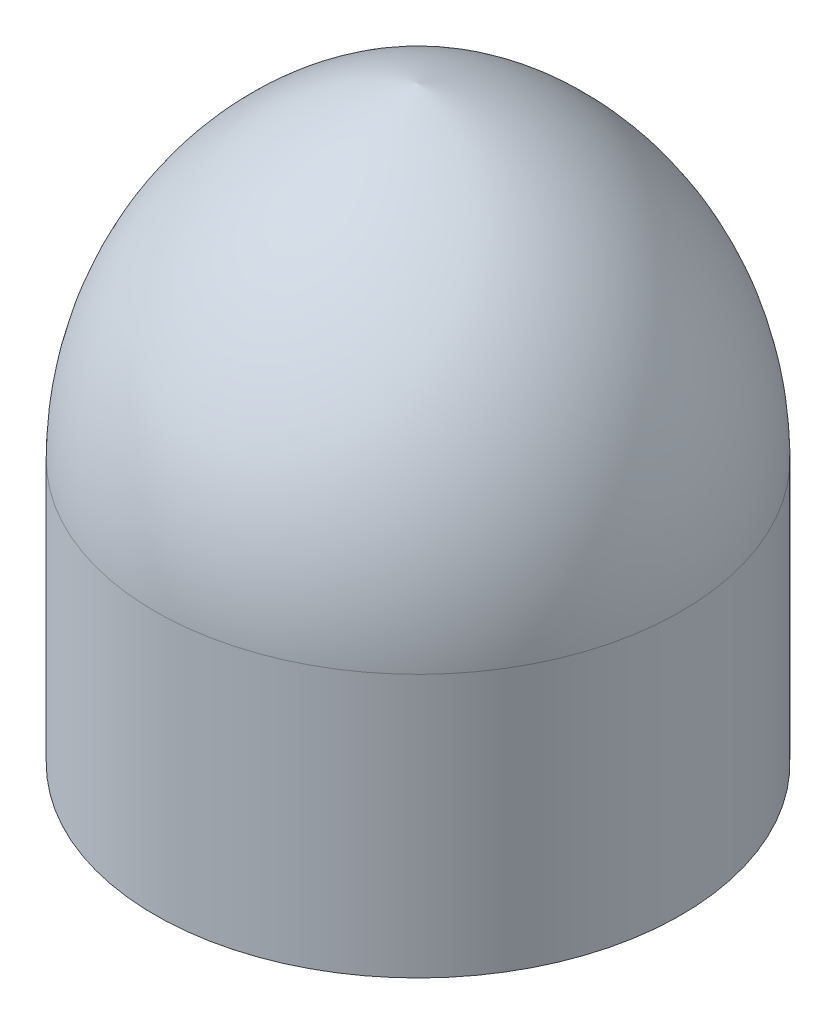
ISO-10303-21;
HEADER;
FILE_DESCRIPTION(('STEP AP214'),'2;1');
FILE_NAME('part.step','',(''),(''),'','','');
FILE_SCHEMA(('AUTOMOTIVE_DESIGN { 1 0 10303 214 1 1 1 1 }'));
ENDSEC;
DATA;
#1=APPLICATION_CONTEXT('core data for automotive mechanical design processes');
#2=APPLICATION_PROTOCOL_DEFINITION('international standard','automotive_design',2000,#1);
#3=PRODUCT_CONTEXT('',#1,'mechanical');
#4=PRODUCT('Part','Part','',(#3));
#5=PRODUCT_RELATED_PRODUCT_CATEGORY('part','',(#4));
#6=PRODUCT_DEFINITION_FORMATION('','',#4);
#7=PRODUCT_DEFINITION_CONTEXT('part definition',#1,'design');
#8=PRODUCT_DEFINITION('design','',#6,#7);
#9=PRODUCT_DEFINITION_SHAPE('','',#8);
#10=(LENGTH_UNIT() NAMED_UNIT(*) SI_UNIT(.MILLI.,.METRE.));
#11=(NAMED_UNIT(*) PLANE_ANGLE_UNIT() SI_UNIT($,.RADIAN.));
#12=(NAMED_UNIT(*) SI_UNIT($,.STERADIAN.) SOLID_ANGLE_UNIT());
#13=UNCERTAINTY_MEASURE_WITH_UNIT(LENGTH_MEASURE(1.E-05),#10,'distance_accuracy_value','');
#14=(GEOMETRIC_REPRESENTATION_CONTEXT(3) GLOBAL_UNCERTAINTY_ASSIGNED_CONTEXT((#13)) GLOBAL_UNIT_ASSIGNED_CONTEXT((#10,
#11,#12)) REPRESENTATION_CONTEXT('',''));
#15=CARTESIAN_POINT('',(0.,0.,0.));
#16=DIRECTION('',(0.,0.,1.));
#17=DIRECTION('',(1.,0.,0.));
#18=AXIS2_PLACEMENT_3D('',#15,#16,#17);
#19=CARTESIAN_POINT('',(0.,0.,0.));
#20=DIRECTION('',(0.,-1.,0.));
#21=DIRECTION('',(0.,0.,-1.));
#22=AXIS2_PLACEMENT_3D('',#19,#20,#21);
#23=PLANE('',#22);
#24=CARTESIAN_POINT('',(0.,0.,0.));
#25=DIRECTION('',(0.,-1.,0.));
#26=DIRECTION('',(0.,0.,-1.));
#27=AXIS2_PLACEMENT_3D('',#24,#25,#26);
#28=CIRCLE('',#27,3.175);
#29=CARTESIAN_POINT('',(0.,0.,-3.175));
#30=VERTEX_POINT('',#29);
#31=EDGE_CURVE('E53',#30,#30,#28,.T.);
#32=ORIENTED_EDGE('',*,*,#31,.F.);
#33=EDGE_LOOP('',(#32));
#34=FACE_BOUND('',#33,.T.);
#35=CARTESIAN_POINT('',(0.,0.,0.));
#36=DIRECTION('',(0.,-1.,0.));
#37=DIRECTION('',(0.,0.,-1.));
#38=AXIS2_PLACEMENT_3D('',#35,#36,#37);
#39=CIRCLE('',#38,7.62);
#40=CARTESIAN_POINT('',(0.,0.,-7.62));
#41=VERTEX_POINT('',#40);
#42=EDGE_CURVE('E11',#41,#41,#39,.T.);
#43=ORIENTED_EDGE('',*,*,#42,.T.);
#44=EDGE_LOOP('',(#43));
#45=FACE_BOUND('',#44,.T.);
#46=ADVANCED_FACE('F33',(#34,#45),#23,.T.);
#47=CARTESIAN_POINT('',(0.,7.62,0.));
#48=DIRECTION('',(0.,-1.,0.));
#49=DIRECTION('',(0.,0.,-1.));
#50=AXIS2_PLACEMENT_3D('',#47,#48,#49);
#51=CYLINDRICAL_SURFACE('',#50,7.62);
#52=CARTESIAN_POINT('',(0.,7.62,0.));
#53=DIRECTION('',(0.,-1.,0.));
#54=DIRECTION('',(0.,0.,-1.));
#55=AXIS2_PLACEMENT_3D('',#52,#53,#54);
#56=CIRCLE('',#55,7.62);
#57=CARTESIAN_POINT('',(0.,7.62,-7.62));
#58=VERTEX_POINT('',#57);
#59=EDGE_CURVE('E39',#58,#58,#56,.T.);
#60=ORIENTED_EDGE('',*,*,#59,.T.);
#61=EDGE_LOOP('',(#60));
#62=FACE_BOUND('',#61,.T.);
#63=ORIENTED_EDGE('',*,*,#42,.F.);
#64=EDGE_LOOP('',(#63));
#65=FACE_BOUND('',#64,.T.);
#66=ADVANCED_FACE('F46',(#62,#65),#51,.T.);
#67=CARTESIAN_POINT('',(0.,7.62,2.032));
#68=DIRECTION('',(-1.,0.,0.));
#69=DIRECTION('',(0.,0.,-1.));
#70=AXIS2_PLACEMENT_3D('',#67,#68,#69);
#71=CIRCLE('',#70,9.652);
#72=TRIMMED_CURVE('',#71,(PARAMETER_VALUE(-1.35868301631567)),
(PARAMETER_VALUE(1.35868301631567)),.T.,.PARAMETER.);
#73=CARTESIAN_POINT('',(0.,7.62,0.));
#74=DIRECTION('',(0.,-1.,0.));
#75=AXIS1_PLACEMENT('',#73,#74);
#76=SURFACE_OF_REVOLUTION('',#72,#75);
#77=CARTESIAN_POINT('',(0.,17.0556812154714,0.));
#78=VERTEX_POINT('',#77);
#79=VERTEX_LOOP('',#78);
#80=FACE_BOUND('',#79,.T.);
#81=ORIENTED_EDGE('',*,*,#59,.F.);
#82=EDGE_LOOP('',(#81));
#83=FACE_BOUND('',#82,.T.);
#84=ADVANCED_FACE('F42',(#80,#83),#76,.T.);
#85=CARTESIAN_POINT('',(0.,12.7,0.));
#86=DIRECTION('',(0.,-1.,0.));
#87=DIRECTION('',(0.,0.,-1.));
#88=AXIS2_PLACEMENT_3D('',#85,#86,#87);
#89=CYLINDRICAL_SURFACE('',#88,3.175);
#90=CARTESIAN_POINT('',(0.,12.7,0.));
#91=DIRECTION('',(0.,-1.,0.));
#92=DIRECTION('',(0.,0.,-1.));
#93=AXIS2_PLACEMENT_3D('',#90,#91,#92);
#94=CIRCLE('',#93,3.175);
#95=CARTESIAN_POINT('',(0.,12.7,-3.175));
#96=VERTEX_POINT('',#95);
#97=EDGE_CURVE('E51',#96,#96,#94,.T.);
#98=ORIENTED_EDGE('',*,*,#97,.F.);
#99=EDGE_LOOP('',(#98));
#100=FACE_BOUND('',#99,.T.);
#101=ORIENTED_EDGE('',*,*,#31,.T.);
#102=EDGE_LOOP('',(#101));
#103=FACE_BOUND('',#102,.T.);
#104=ADVANCED_FACE('F45',(#100,#103),#89,.F.);
#105=CARTESIAN_POINT('',(0.,12.7,0.));
#106=DIRECTION('',(0.,-1.,0.));
#107=DIRECTION('',(0.,0.,-1.));
#108=AXIS2_PLACEMENT_3D('',#105,#106,#107);
#109=PLANE('',#108);
#110=ORIENTED_EDGE('',*,*,#97,.T.);
#111=EDGE_LOOP('',(#110));
#112=FACE_BOUND('',#111,.T.);
#113=ADVANCED_FACE('F70',(#112),#109,.T.);
#114=CLOSED_SHELL('',(#46,#66,#84,#104,#113));
#115=MANIFOLD_SOLID_BREP('B2',#114);
#116=ADVANCED_BREP_SHAPE_REPRESENTATION('',(#18,#115),#14);
#117=SHAPE_DEFINITION_REPRESENTATION(#9,#116);
ENDSEC;
END-ISO-10303-21;
